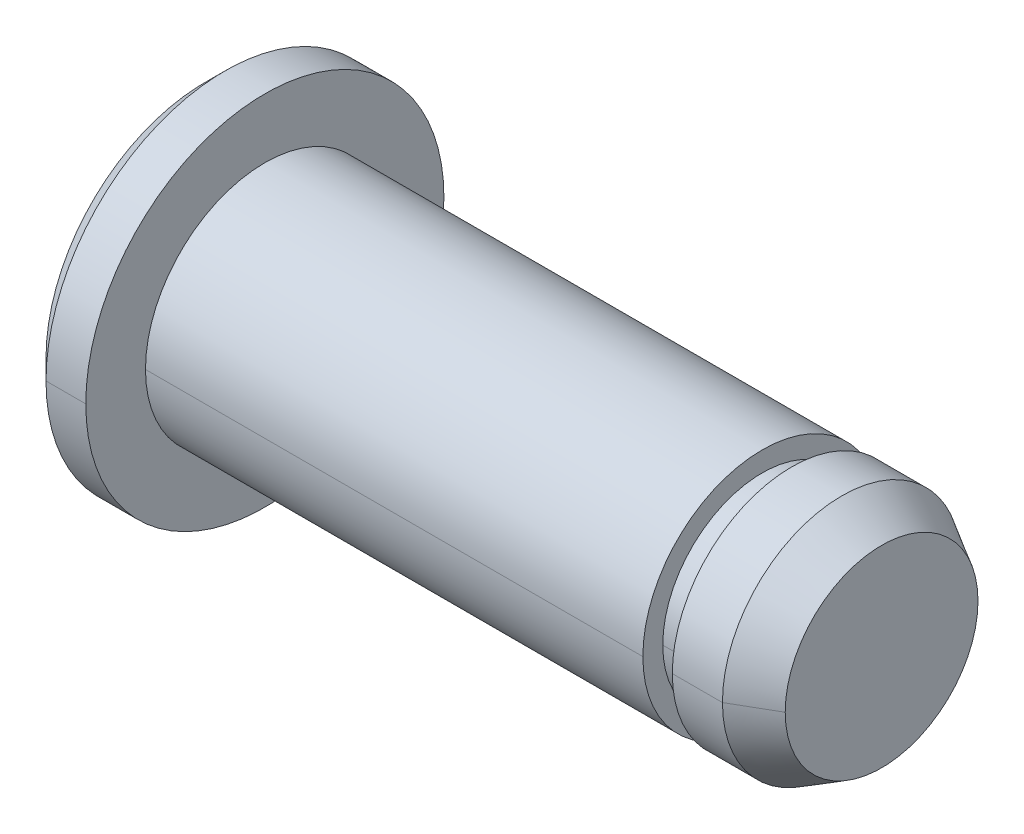
ISO-10303-21;
HEADER;
FILE_DESCRIPTION(('STEP AP214'),'2;1');
FILE_NAME('part.step','',(''),(''),'','','');
FILE_SCHEMA(('AUTOMOTIVE_DESIGN { 1 0 10303 214 1 1 1 1 }'));
ENDSEC;
DATA;
#1=APPLICATION_CONTEXT('core data for automotive mechanical design processes');
#2=APPLICATION_PROTOCOL_DEFINITION('international standard','automotive_design',2000,#1);
#3=PRODUCT_CONTEXT('',#1,'mechanical');
#4=PRODUCT('Part','Part','',(#3));
#5=PRODUCT_RELATED_PRODUCT_CATEGORY('part','',(#4));
#6=PRODUCT_DEFINITION_FORMATION('','',#4);
#7=PRODUCT_DEFINITION_CONTEXT('part definition',#1,'design');
#8=PRODUCT_DEFINITION('design','',#6,#7);
#9=PRODUCT_DEFINITION_SHAPE('','',#8);
#10=(LENGTH_UNIT() NAMED_UNIT(*) SI_UNIT(.MILLI.,.METRE.));
#11=(NAMED_UNIT(*) PLANE_ANGLE_UNIT() SI_UNIT($,.RADIAN.));
#12=(NAMED_UNIT(*) SI_UNIT($,.STERADIAN.) SOLID_ANGLE_UNIT());
#13=UNCERTAINTY_MEASURE_WITH_UNIT(LENGTH_MEASURE(1.E-05),#10,'distance_accuracy_value','');
#14=(GEOMETRIC_REPRESENTATION_CONTEXT(3) GLOBAL_UNCERTAINTY_ASSIGNED_CONTEXT((#13)) GLOBAL_UNIT_ASSIGNED_CONTEXT((#10,
#11,#12)) REPRESENTATION_CONTEXT('',''));
#15=CARTESIAN_POINT('',(0.,0.,0.));
#16=DIRECTION('',(0.,0.,1.));
#17=DIRECTION('',(1.,0.,0.));
#18=AXIS2_PLACEMENT_3D('',#15,#16,#17);
#19=CARTESIAN_POINT('',(-1.5,0.,0.));
#20=DIRECTION('',(1.,0.,0.));
#21=DIRECTION('',(0.,0.,-1.));
#22=AXIS2_PLACEMENT_3D('',#19,#20,#21);
#23=PLANE('',#22);
#24=CARTESIAN_POINT('',(-1.5,0.,0.));
#25=DIRECTION('',(1.,0.,0.));
#26=DIRECTION('',(0.,0.,-1.));
#27=AXIS2_PLACEMENT_3D('',#24,#25,#26);
#28=CIRCLE('',#27,4.);
#29=CARTESIAN_POINT('',(-1.5,0.,4.));
#30=VERTEX_POINT('',#29);
#31=CARTESIAN_POINT('',(-1.5,0.,-4.));
#32=VERTEX_POINT('',#31);
#33=EDGE_CURVE('E11',#30,#32,#28,.T.);
#34=ORIENTED_EDGE('',*,*,#33,.F.);
#35=CARTESIAN_POINT('',(-1.5,0.,0.));
#36=DIRECTION('',(1.,0.,0.));
#37=DIRECTION('',(0.,0.,-1.));
#38=AXIS2_PLACEMENT_3D('',#35,#36,#37);
#39=CIRCLE('',#38,4.);
#40=EDGE_CURVE('E25',#32,#30,#39,.T.);
#41=ORIENTED_EDGE('',*,*,#40,.F.);
#42=EDGE_LOOP('',(#34,#41));
#43=FACE_BOUND('',#42,.T.);
#44=ADVANCED_FACE('F17',(#43),#23,.F.);
#45=CARTESIAN_POINT('',(-1.5,0.,0.));
#46=DIRECTION('',(1.,0.,0.));
#47=DIRECTION('',(0.,-1.,0.));
#48=AXIS2_PLACEMENT_3D('',#45,#46,#47);
#49=CONICAL_SURFACE('',#48,4.,0.785398163397448);
#50=DIRECTION('',(0.707106781186548,0.,0.707106781186548));
#51=VECTOR('',#50,1.);
#52=CARTESIAN_POINT('',(-1.5,0.,4.));
#53=LINE('',#52,#51);
#54=CARTESIAN_POINT('',(-1.,0.,4.5));
#55=VERTEX_POINT('',#54);
#56=EDGE_CURVE('E235',#30,#55,#53,.T.);
#57=ORIENTED_EDGE('',*,*,#56,.T.);
#58=CARTESIAN_POINT('',(-1.,0.,0.));
#59=DIRECTION('',(1.,0.,0.));
#60=DIRECTION('',(0.,0.,-1.));
#61=AXIS2_PLACEMENT_3D('',#58,#59,#60);
#62=CIRCLE('',#61,4.5);
#63=CARTESIAN_POINT('',(-1.,0.,-4.5));
#64=VERTEX_POINT('',#63);
#65=EDGE_CURVE('E230',#64,#55,#62,.T.);
#66=ORIENTED_EDGE('',*,*,#65,.F.);
#67=DIRECTION('',(0.707106781186548,0.,-0.707106781186548));
#68=VECTOR('',#67,1.);
#69=CARTESIAN_POINT('',(-1.5,0.,-4.));
#70=LINE('',#69,#68);
#71=EDGE_CURVE('E225',#32,#64,#70,.T.);
#72=ORIENTED_EDGE('',*,*,#71,.F.);
#73=ORIENTED_EDGE('',*,*,#40,.T.);
#74=EDGE_LOOP('',(#57,#66,#72,#73));
#75=FACE_BOUND('',#74,.T.);
#76=ADVANCED_FACE('F244',(#75),#49,.T.);
#77=CARTESIAN_POINT('',(-1.5,0.,0.));
#78=DIRECTION('',(1.,0.,0.));
#79=DIRECTION('',(0.,1.,0.));
#80=AXIS2_PLACEMENT_3D('',#77,#78,#79);
#81=CONICAL_SURFACE('',#80,4.,0.785398163397448);
#82=ORIENTED_EDGE('',*,*,#56,.F.);
#83=ORIENTED_EDGE('',*,*,#33,.T.);
#84=ORIENTED_EDGE('',*,*,#71,.T.);
#85=CARTESIAN_POINT('',(-1.,0.,0.));
#86=DIRECTION('',(1.,0.,0.));
#87=DIRECTION('',(0.,0.,-1.));
#88=AXIS2_PLACEMENT_3D('',#85,#86,#87);
#89=CIRCLE('',#88,4.5);
#90=EDGE_CURVE('E220',#55,#64,#89,.T.);
#91=ORIENTED_EDGE('',*,*,#90,.F.);
#92=EDGE_LOOP('',(#82,#83,#84,#91));
#93=FACE_BOUND('',#92,.T.);
#94=ADVANCED_FACE('F247',(#93),#81,.T.);
#95=CARTESIAN_POINT('',(15.5,0.,0.));
#96=DIRECTION('',(1.,0.,0.));
#97=DIRECTION('',(0.,1.,-2.38000569422679E-10));
#98=AXIS2_PLACEMENT_3D('',#95,#96,#97);
#99=CYLINDRICAL_SURFACE('',#98,4.5);
#100=DIRECTION('',(1.,0.,0.));
#101=VECTOR('',#100,1.);
#102=CARTESIAN_POINT('',(-1.,0.,4.5));
#103=LINE('',#102,#101);
#104=CARTESIAN_POINT('',(0.,0.,4.5));
#105=VERTEX_POINT('',#104);
#106=EDGE_CURVE('E215',#55,#105,#103,.T.);
#107=ORIENTED_EDGE('',*,*,#106,.F.);
#108=ORIENTED_EDGE('',*,*,#90,.T.);
#109=DIRECTION('',(1.,0.,0.));
#110=VECTOR('',#109,1.);
#111=CARTESIAN_POINT('',(-1.,0.,-4.5));
#112=LINE('',#111,#110);
#113=CARTESIAN_POINT('',(0.,0.,-4.5));
#114=VERTEX_POINT('',#113);
#115=EDGE_CURVE('E211',#64,#114,#112,.T.);
#116=ORIENTED_EDGE('',*,*,#115,.T.);
#117=CARTESIAN_POINT('',(0.,0.,0.));
#118=DIRECTION('',(1.,0.,0.));
#119=DIRECTION('',(0.,0.,-1.));
#120=AXIS2_PLACEMENT_3D('',#117,#118,#119);
#121=CIRCLE('',#120,4.5);
#122=EDGE_CURVE('E206',#105,#114,#121,.T.);
#123=ORIENTED_EDGE('',*,*,#122,.F.);
#124=EDGE_LOOP('',(#107,#108,#116,#123));
#125=FACE_BOUND('',#124,.T.);
#126=ADVANCED_FACE('F251',(#125),#99,.T.);
#127=CARTESIAN_POINT('',(0.,4.5,0.));
#128=DIRECTION('',(-1.,0.,0.));
#129=DIRECTION('',(0.,0.,1.));
#130=AXIS2_PLACEMENT_3D('',#127,#128,#129);
#131=PLANE('',#130);
#132=CARTESIAN_POINT('',(0.,0.,0.));
#133=DIRECTION('',(1.,0.,0.));
#134=DIRECTION('',(0.,0.,-1.));
#135=AXIS2_PLACEMENT_3D('',#132,#133,#134);
#136=CIRCLE('',#135,3.);
#137=CARTESIAN_POINT('',(0.,0.,3.));
#138=VERTEX_POINT('',#137);
#139=CARTESIAN_POINT('',(0.,0.,-3.));
#140=VERTEX_POINT('',#139);
#141=EDGE_CURVE('E201',#138,#140,#136,.T.);
#142=ORIENTED_EDGE('',*,*,#141,.F.);
#143=CARTESIAN_POINT('',(0.,0.,0.));
#144=DIRECTION('',(1.,0.,0.));
#145=DIRECTION('',(0.,0.,-1.));
#146=AXIS2_PLACEMENT_3D('',#143,#144,#145);
#147=CIRCLE('',#146,3.);
#148=EDGE_CURVE('E196',#140,#138,#147,.T.);
#149=ORIENTED_EDGE('',*,*,#148,.F.);
#150=EDGE_LOOP('',(#142,#149));
#151=FACE_BOUND('',#150,.T.);
#152=CARTESIAN_POINT('',(0.,0.,0.));
#153=DIRECTION('',(1.,0.,0.));
#154=DIRECTION('',(0.,0.,-1.));
#155=AXIS2_PLACEMENT_3D('',#152,#153,#154);
#156=CIRCLE('',#155,4.5);
#157=EDGE_CURVE('E191',#114,#105,#156,.T.);
#158=ORIENTED_EDGE('',*,*,#157,.T.);
#159=ORIENTED_EDGE('',*,*,#122,.T.);
#160=EDGE_LOOP('',(#158,#159));
#161=FACE_BOUND('',#160,.T.);
#162=ADVANCED_FACE('F256',(#151,#161),#131,.F.);
#163=CARTESIAN_POINT('',(15.5,0.,0.));
#164=DIRECTION('',(1.,0.,0.));
#165=DIRECTION('',(0.,-1.,0.));
#166=AXIS2_PLACEMENT_3D('',#163,#164,#165);
#167=CYLINDRICAL_SURFACE('',#166,4.5);
#168=ORIENTED_EDGE('',*,*,#106,.T.);
#169=ORIENTED_EDGE('',*,*,#157,.F.);
#170=ORIENTED_EDGE('',*,*,#115,.F.);
#171=ORIENTED_EDGE('',*,*,#65,.T.);
#172=EDGE_LOOP('',(#168,#169,#170,#171));
#173=FACE_BOUND('',#172,.T.);
#174=ADVANCED_FACE('F254',(#173),#167,.T.);
#175=CARTESIAN_POINT('',(15.5,0.,0.));
#176=DIRECTION('',(1.,0.,0.));
#177=DIRECTION('',(0.,-1.,0.));
#178=AXIS2_PLACEMENT_3D('',#175,#176,#177);
#179=CYLINDRICAL_SURFACE('',#178,3.);
#180=DIRECTION('',(1.,0.,0.));
#181=VECTOR('',#180,1.);
#182=CARTESIAN_POINT('',(0.,0.,3.));
#183=LINE('',#182,#181);
#184=CARTESIAN_POINT('',(12.5,0.,3.));
#185=VERTEX_POINT('',#184);
#186=EDGE_CURVE('E187',#138,#185,#183,.T.);
#187=ORIENTED_EDGE('',*,*,#186,.T.);
#188=CARTESIAN_POINT('',(12.5,0.,0.));
#189=DIRECTION('',(1.,0.,0.));
#190=DIRECTION('',(0.,0.,-1.));
#191=AXIS2_PLACEMENT_3D('',#188,#189,#190);
#192=CIRCLE('',#191,3.);
#193=CARTESIAN_POINT('',(12.5,0.,-3.));
#194=VERTEX_POINT('',#193);
#195=EDGE_CURVE('E182',#194,#185,#192,.T.);
#196=ORIENTED_EDGE('',*,*,#195,.F.);
#197=DIRECTION('',(1.,0.,0.));
#198=VECTOR('',#197,1.);
#199=CARTESIAN_POINT('',(0.,0.,-3.));
#200=LINE('',#199,#198);
#201=EDGE_CURVE('E177',#140,#194,#200,.T.);
#202=ORIENTED_EDGE('',*,*,#201,.F.);
#203=ORIENTED_EDGE('',*,*,#148,.T.);
#204=EDGE_LOOP('',(#187,#196,#202,#203));
#205=FACE_BOUND('',#204,.T.);
#206=ADVANCED_FACE('F265',(#205),#179,.T.);
#207=CARTESIAN_POINT('',(15.5,0.,0.));
#208=DIRECTION('',(1.,0.,0.));
#209=DIRECTION('',(0.,1.,0.));
#210=AXIS2_PLACEMENT_3D('',#207,#208,#209);
#211=CYLINDRICAL_SURFACE('',#210,3.);
#212=ORIENTED_EDGE('',*,*,#186,.F.);
#213=ORIENTED_EDGE('',*,*,#141,.T.);
#214=ORIENTED_EDGE('',*,*,#201,.T.);
#215=CARTESIAN_POINT('',(12.5,0.,0.));
#216=DIRECTION('',(1.,0.,0.));
#217=DIRECTION('',(0.,0.,-1.));
#218=AXIS2_PLACEMENT_3D('',#215,#216,#217);
#219=CIRCLE('',#218,3.);
#220=EDGE_CURVE('E172',#185,#194,#219,.T.);
#221=ORIENTED_EDGE('',*,*,#220,.F.);
#222=EDGE_LOOP('',(#212,#213,#214,#221));
#223=FACE_BOUND('',#222,.T.);
#224=ADVANCED_FACE('F310',(#223),#211,.T.);
#225=CARTESIAN_POINT('',(12.5,3.,0.));
#226=DIRECTION('',(-1.,0.,0.));
#227=DIRECTION('',(0.,0.,1.));
#228=AXIS2_PLACEMENT_3D('',#225,#226,#227);
#229=PLANE('',#228);
#230=CARTESIAN_POINT('',(12.5,0.,0.));
#231=DIRECTION('',(1.,0.,0.));
#232=DIRECTION('',(0.,0.,-1.));
#233=AXIS2_PLACEMENT_3D('',#230,#231,#232);
#234=CIRCLE('',#233,2.5);
#235=CARTESIAN_POINT('',(12.5,0.,2.5));
#236=VERTEX_POINT('',#235);
#237=CARTESIAN_POINT('',(12.5,0.,-2.5));
#238=VERTEX_POINT('',#237);
#239=EDGE_CURVE('E167',#236,#238,#234,.T.);
#240=ORIENTED_EDGE('',*,*,#239,.F.);
#241=CARTESIAN_POINT('',(12.5,0.,0.));
#242=DIRECTION('',(1.,0.,0.));
#243=DIRECTION('',(0.,0.,-1.));
#244=AXIS2_PLACEMENT_3D('',#241,#242,#243);
#245=CIRCLE('',#244,2.5);
#246=EDGE_CURVE('E162',#238,#236,#245,.T.);
#247=ORIENTED_EDGE('',*,*,#246,.F.);
#248=EDGE_LOOP('',(#240,#247));
#249=FACE_BOUND('',#248,.T.);
#250=ORIENTED_EDGE('',*,*,#195,.T.);
#251=ORIENTED_EDGE('',*,*,#220,.T.);
#252=EDGE_LOOP('',(#250,#251));
#253=FACE_BOUND('',#252,.T.);
#254=ADVANCED_FACE('F321',(#249,#253),#229,.F.);
#255=CARTESIAN_POINT('',(15.5,0.,0.));
#256=DIRECTION('',(1.,0.,0.));
#257=DIRECTION('',(0.,-1.,0.));
#258=AXIS2_PLACEMENT_3D('',#255,#256,#257);
#259=CYLINDRICAL_SURFACE('',#258,2.5);
#260=DIRECTION('',(1.,0.,0.));
#261=VECTOR('',#260,1.);
#262=CARTESIAN_POINT('',(12.5,0.,2.5));
#263=LINE('',#262,#261);
#264=CARTESIAN_POINT('',(13.24,0.,2.5));
#265=VERTEX_POINT('',#264);
#266=EDGE_CURVE('E158',#236,#265,#263,.T.);
#267=ORIENTED_EDGE('',*,*,#266,.T.);
#268=CARTESIAN_POINT('',(13.24,0.,0.));
#269=DIRECTION('',(1.,0.,0.));
#270=DIRECTION('',(0.,0.,-1.));
#271=AXIS2_PLACEMENT_3D('',#268,#269,#270);
#272=CIRCLE('',#271,2.5);
#273=CARTESIAN_POINT('',(13.24,0.,-2.5));
#274=VERTEX_POINT('',#273);
#275=EDGE_CURVE('E153',#274,#265,#272,.T.);
#276=ORIENTED_EDGE('',*,*,#275,.F.);
#277=DIRECTION('',(1.,0.,0.));
#278=VECTOR('',#277,1.);
#279=CARTESIAN_POINT('',(12.5,0.,-2.5));
#280=LINE('',#279,#278);
#281=EDGE_CURVE('E148',#238,#274,#280,.T.);
#282=ORIENTED_EDGE('',*,*,#281,.F.);
#283=ORIENTED_EDGE('',*,*,#246,.T.);
#284=EDGE_LOOP('',(#267,#276,#282,#283));
#285=FACE_BOUND('',#284,.T.);
#286=ADVANCED_FACE('F332',(#285),#259,.T.);
#287=CARTESIAN_POINT('',(15.5,0.,0.));
#288=DIRECTION('',(1.,0.,0.));
#289=DIRECTION('',(0.,1.,0.));
#290=AXIS2_PLACEMENT_3D('',#287,#288,#289);
#291=CYLINDRICAL_SURFACE('',#290,2.5);
#292=ORIENTED_EDGE('',*,*,#266,.F.);
#293=ORIENTED_EDGE('',*,*,#239,.T.);
#294=ORIENTED_EDGE('',*,*,#281,.T.);
#295=CARTESIAN_POINT('',(13.24,0.,0.));
#296=DIRECTION('',(1.,0.,0.));
#297=DIRECTION('',(0.,0.,-1.));
#298=AXIS2_PLACEMENT_3D('',#295,#296,#297);
#299=CIRCLE('',#298,2.5);
#300=EDGE_CURVE('E143',#265,#274,#299,.T.);
#301=ORIENTED_EDGE('',*,*,#300,.F.);
#302=EDGE_LOOP('',(#292,#293,#294,#301));
#303=FACE_BOUND('',#302,.T.);
#304=ADVANCED_FACE('F343',(#303),#291,.T.);
#305=CARTESIAN_POINT('',(13.24,2.5,0.));
#306=DIRECTION('',(1.,0.,0.));
#307=DIRECTION('',(0.,0.,-1.));
#308=AXIS2_PLACEMENT_3D('',#305,#306,#307);
#309=PLANE('',#308);
#310=CARTESIAN_POINT('',(13.24,0.,0.));
#311=DIRECTION('',(1.,0.,0.));
#312=DIRECTION('',(0.,0.,-1.));
#313=AXIS2_PLACEMENT_3D('',#310,#311,#312);
#314=CIRCLE('',#313,3.);
#315=CARTESIAN_POINT('',(13.24,0.,3.));
#316=VERTEX_POINT('',#315);
#317=CARTESIAN_POINT('',(13.24,0.,-3.));
#318=VERTEX_POINT('',#317);
#319=EDGE_CURVE('E138',#316,#318,#314,.T.);
#320=ORIENTED_EDGE('',*,*,#319,.F.);
#321=CARTESIAN_POINT('',(13.24,0.,0.));
#322=DIRECTION('',(1.,0.,0.));
#323=DIRECTION('',(0.,0.,-1.));
#324=AXIS2_PLACEMENT_3D('',#321,#322,#323);
#325=CIRCLE('',#324,3.);
#326=EDGE_CURVE('E133',#318,#316,#325,.T.);
#327=ORIENTED_EDGE('',*,*,#326,.F.);
#328=EDGE_LOOP('',(#320,#327));
#329=FACE_BOUND('',#328,.T.);
#330=ORIENTED_EDGE('',*,*,#275,.T.);
#331=ORIENTED_EDGE('',*,*,#300,.T.);
#332=EDGE_LOOP('',(#330,#331));
#333=FACE_BOUND('',#332,.T.);
#334=ADVANCED_FACE('F354',(#329,#333),#309,.F.);
#335=CARTESIAN_POINT('',(15.5,0.,0.));
#336=DIRECTION('',(1.,0.,0.));
#337=DIRECTION('',(0.,-1.,0.));
#338=AXIS2_PLACEMENT_3D('',#335,#336,#337);
#339=CYLINDRICAL_SURFACE('',#338,3.);
#340=DIRECTION('',(1.,0.,0.));
#341=VECTOR('',#340,1.);
#342=CARTESIAN_POINT('',(13.24,0.,3.));
#343=LINE('',#342,#341);
#344=CARTESIAN_POINT('',(14.5,0.,3.));
#345=VERTEX_POINT('',#344);
#346=EDGE_CURVE('E129',#316,#345,#343,.T.);
#347=ORIENTED_EDGE('',*,*,#346,.T.);
#348=CARTESIAN_POINT('',(14.5,0.,0.));
#349=DIRECTION('',(1.,0.,0.));
#350=DIRECTION('',(0.,0.,-1.));
#351=AXIS2_PLACEMENT_3D('',#348,#349,#350);
#352=CIRCLE('',#351,3.);
#353=CARTESIAN_POINT('',(14.5,0.,-3.));
#354=VERTEX_POINT('',#353);
#355=EDGE_CURVE('E105',#354,#345,#352,.T.);
#356=ORIENTED_EDGE('',*,*,#355,.F.);
#357=DIRECTION('',(1.,0.,0.));
#358=VECTOR('',#357,1.);
#359=CARTESIAN_POINT('',(13.24,0.,-3.));
#360=LINE('',#359,#358);
#361=EDGE_CURVE('E121',#318,#354,#360,.T.);
#362=ORIENTED_EDGE('',*,*,#361,.F.);
#363=ORIENTED_EDGE('',*,*,#326,.T.);
#364=EDGE_LOOP('',(#347,#356,#362,#363));
#365=FACE_BOUND('',#364,.T.);
#366=ADVANCED_FACE('F365',(#365),#339,.T.);
#367=CARTESIAN_POINT('',(15.5,0.,0.));
#368=DIRECTION('',(1.,0.,0.));
#369=DIRECTION('',(0.,1.,-1.61702901641324E-09));
#370=AXIS2_PLACEMENT_3D('',#367,#368,#369);
#371=CYLINDRICAL_SURFACE('',#370,3.);
#372=ORIENTED_EDGE('',*,*,#346,.F.);
#373=ORIENTED_EDGE('',*,*,#319,.T.);
#374=ORIENTED_EDGE('',*,*,#361,.T.);
#375=CARTESIAN_POINT('',(14.5,0.,0.));
#376=DIRECTION('',(1.,0.,0.));
#377=DIRECTION('',(0.,0.,-1.));
#378=AXIS2_PLACEMENT_3D('',#375,#376,#377);
#379=CIRCLE('',#378,3.);
#380=EDGE_CURVE('E117',#345,#354,#379,.T.);
#381=ORIENTED_EDGE('',*,*,#380,.F.);
#382=EDGE_LOOP('',(#372,#373,#374,#381));
#383=FACE_BOUND('',#382,.T.);
#384=ADVANCED_FACE('F376',(#383),#371,.T.);
#385=CARTESIAN_POINT('',(14.5,0.,0.));
#386=DIRECTION('',(-1.,0.,0.));
#387=DIRECTION('',(0.,1.,0.));
#388=AXIS2_PLACEMENT_3D('',#385,#386,#387);
#389=CONICAL_SURFACE('',#388,3.,0.523598775598279);
#390=DIRECTION('',(-0.866025403784448,0.,-0.499999999999983));
#391=VECTOR('',#390,1.);
#392=CARTESIAN_POINT('',(15.5,0.,-2.4226497308104));
#393=LINE('',#392,#391);
#394=CARTESIAN_POINT('',(15.5,0.,-2.4226497308104));
#395=VERTEX_POINT('',#394);
#396=EDGE_CURVE('E97',#395,#354,#393,.T.);
#397=ORIENTED_EDGE('',*,*,#396,.F.);
#398=CARTESIAN_POINT('',(15.5,0.,0.));
#399=DIRECTION('',(1.,0.,0.));
#400=DIRECTION('',(0.,0.,-1.));
#401=AXIS2_PLACEMENT_3D('',#398,#399,#400);
#402=CIRCLE('',#401,2.4226497308104);
#403=CARTESIAN_POINT('',(15.5,0.,2.4226497308104));
#404=VERTEX_POINT('',#403);
#405=EDGE_CURVE('E90',#404,#395,#402,.T.);
#406=ORIENTED_EDGE('',*,*,#405,.F.);
#407=DIRECTION('',(-0.866025403784448,0.,0.499999999999983));
#408=VECTOR('',#407,1.);
#409=CARTESIAN_POINT('',(15.5,0.,2.4226497308104));
#410=LINE('',#409,#408);
#411=EDGE_CURVE('E94',#404,#345,#410,.T.);
#412=ORIENTED_EDGE('',*,*,#411,.T.);
#413=ORIENTED_EDGE('',*,*,#380,.T.);
#414=EDGE_LOOP('',(#397,#406,#412,#413));
#415=FACE_BOUND('',#414,.T.);
#416=ADVANCED_FACE('F92',(#415),#389,.T.);
#417=CARTESIAN_POINT('',(14.5,0.,0.));
#418=DIRECTION('',(-1.,0.,0.));
#419=DIRECTION('',(0.,-1.,0.));
#420=AXIS2_PLACEMENT_3D('',#417,#418,#419);
#421=CONICAL_SURFACE('',#420,3.,0.523598775598279);
#422=ORIENTED_EDGE('',*,*,#396,.T.);
#423=ORIENTED_EDGE('',*,*,#355,.T.);
#424=ORIENTED_EDGE('',*,*,#411,.F.);
#425=CARTESIAN_POINT('',(15.5,0.,0.));
#426=DIRECTION('',(1.,0.,0.));
#427=DIRECTION('',(0.,0.,-1.));
#428=AXIS2_PLACEMENT_3D('',#425,#426,#427);
#429=CIRCLE('',#428,2.4226497308104);
#430=EDGE_CURVE('E104',#395,#404,#429,.T.);
#431=ORIENTED_EDGE('',*,*,#430,.F.);
#432=EDGE_LOOP('',(#422,#423,#424,#431));
#433=FACE_BOUND('',#432,.T.);
#434=ADVANCED_FACE('F103',(#433),#421,.T.);
#435=CARTESIAN_POINT('',(15.5,2.4226497308104,0.));
#436=DIRECTION('',(-1.,0.,0.));
#437=DIRECTION('',(0.,0.,1.));
#438=AXIS2_PLACEMENT_3D('',#435,#436,#437);
#439=PLANE('',#438);
#440=ORIENTED_EDGE('',*,*,#430,.T.);
#441=ORIENTED_EDGE('',*,*,#405,.T.);
#442=EDGE_LOOP('',(#440,#441));
#443=FACE_BOUND('',#442,.T.);
#444=ADVANCED_FACE('F107',(#443),#439,.F.);
#445=CLOSED_SHELL('',(#44,#76,#94,#126,#162,#174,#206,#224,#254,#286,#304,#334,#366,#384,#416,
#434,#444));
#446=MANIFOLD_SOLID_BREP('B1',#445);
#447=ADVANCED_BREP_SHAPE_REPRESENTATION('',(#18,#446),#14);
#448=SHAPE_DEFINITION_REPRESENTATION(#9,#447);
ENDSEC;
END-ISO-10303-21;
